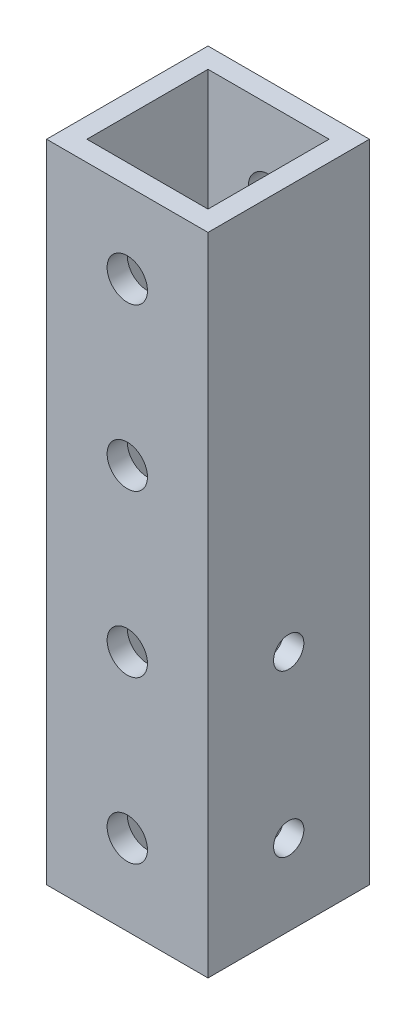
ISO-10303-21;
HEADER;
FILE_DESCRIPTION(('STEP AP214'),'2;1');
FILE_NAME('part.step','',(''),(''),'','','');
FILE_SCHEMA(('AUTOMOTIVE_DESIGN { 1 0 10303 214 1 1 1 1 }'));
ENDSEC;
DATA;
#1=APPLICATION_CONTEXT('core data for automotive mechanical design processes');
#2=APPLICATION_PROTOCOL_DEFINITION('international standard','automotive_design',2000,#1);
#3=PRODUCT_CONTEXT('',#1,'mechanical');
#4=PRODUCT('Part','Part','',(#3));
#5=PRODUCT_RELATED_PRODUCT_CATEGORY('part','',(#4));
#6=PRODUCT_DEFINITION_FORMATION('','',#4);
#7=PRODUCT_DEFINITION_CONTEXT('part definition',#1,'design');
#8=PRODUCT_DEFINITION('design','',#6,#7);
#9=PRODUCT_DEFINITION_SHAPE('','',#8);
#10=(LENGTH_UNIT() NAMED_UNIT(*) SI_UNIT(.MILLI.,.METRE.));
#11=(NAMED_UNIT(*) PLANE_ANGLE_UNIT() SI_UNIT($,.RADIAN.));
#12=(NAMED_UNIT(*) SI_UNIT($,.STERADIAN.) SOLID_ANGLE_UNIT());
#13=UNCERTAINTY_MEASURE_WITH_UNIT(LENGTH_MEASURE(1.E-05),#10,'distance_accuracy_value','');
#14=(GEOMETRIC_REPRESENTATION_CONTEXT(3) GLOBAL_UNCERTAINTY_ASSIGNED_CONTEXT((#13)) GLOBAL_UNIT_ASSIGNED_CONTEXT((#10,
#11,#12)) REPRESENTATION_CONTEXT('',''));
#15=CARTESIAN_POINT('',(0.,0.,0.));
#16=DIRECTION('',(0.,0.,1.));
#17=DIRECTION('',(1.,0.,0.));
#18=AXIS2_PLACEMENT_3D('',#15,#16,#17);
#19=CARTESIAN_POINT('',(0.,0.,25.4));
#20=DIRECTION('',(0.,1.,0.));
#21=DIRECTION('',(0.,0.,1.));
#22=AXIS2_PLACEMENT_3D('',#19,#20,#21);
#23=PLANE('',#22);
#24=DIRECTION('',(1.,0.,0.));
#25=VECTOR('',#24,1.);
#26=CARTESIAN_POINT('',(0.,0.,0.));
#27=LINE('',#26,#25);
#28=CARTESIAN_POINT('',(0.,0.,0.));
#29=VERTEX_POINT('',#28);
#30=CARTESIAN_POINT('',(25.4,0.,0.));
#31=VERTEX_POINT('',#30);
#32=EDGE_CURVE('E152',#29,#31,#27,.T.);
#33=ORIENTED_EDGE('',*,*,#32,.T.);
#34=DIRECTION('',(0.,0.,-1.));
#35=VECTOR('',#34,1.);
#36=CARTESIAN_POINT('',(25.4,0.,25.4));
#37=LINE('',#36,#35);
#38=CARTESIAN_POINT('',(25.4,0.,25.4));
#39=VERTEX_POINT('',#38);
#40=EDGE_CURVE('E46',#39,#31,#37,.T.);
#41=ORIENTED_EDGE('',*,*,#40,.F.);
#42=DIRECTION('',(1.,0.,0.));
#43=VECTOR('',#42,1.);
#44=CARTESIAN_POINT('',(0.,0.,25.4));
#45=LINE('',#44,#43);
#46=CARTESIAN_POINT('',(0.,0.,25.4));
#47=VERTEX_POINT('',#46);
#48=EDGE_CURVE('E142',#47,#39,#45,.T.);
#49=ORIENTED_EDGE('',*,*,#48,.F.);
#50=DIRECTION('',(0.,0.,-1.));
#51=VECTOR('',#50,1.);
#52=CARTESIAN_POINT('',(0.,0.,25.4));
#53=LINE('',#52,#51);
#54=EDGE_CURVE('E11',#47,#29,#53,.T.);
#55=ORIENTED_EDGE('',*,*,#54,.T.);
#56=EDGE_LOOP('',(#33,#41,#49,#55));
#57=FACE_BOUND('',#56,.T.);
#58=DIRECTION('',(1.,0.,0.));
#59=VECTOR('',#58,1.);
#60=CARTESIAN_POINT('',(0.,0.,3.175));
#61=LINE('',#60,#59);
#62=CARTESIAN_POINT('',(3.175,0.,3.175));
#63=VERTEX_POINT('',#62);
#64=CARTESIAN_POINT('',(22.225,0.,3.175));
#65=VERTEX_POINT('',#64);
#66=EDGE_CURVE('E117',#63,#65,#61,.T.);
#67=ORIENTED_EDGE('',*,*,#66,.F.);
#68=DIRECTION('',(0.,0.,-1.));
#69=VECTOR('',#68,1.);
#70=CARTESIAN_POINT('',(3.175,0.,25.4));
#71=LINE('',#70,#69);
#72=CARTESIAN_POINT('',(3.175,0.,22.225));
#73=VERTEX_POINT('',#72);
#74=EDGE_CURVE('E104',#73,#63,#71,.T.);
#75=ORIENTED_EDGE('',*,*,#74,.F.);
#76=DIRECTION('',(1.,0.,0.));
#77=VECTOR('',#76,1.);
#78=CARTESIAN_POINT('',(0.,0.,22.225));
#79=LINE('',#78,#77);
#80=CARTESIAN_POINT('',(22.225,0.,22.225));
#81=VERTEX_POINT('',#80);
#82=EDGE_CURVE('E130',#73,#81,#79,.T.);
#83=ORIENTED_EDGE('',*,*,#82,.T.);
#84=DIRECTION('',(0.,0.,-1.));
#85=VECTOR('',#84,1.);
#86=CARTESIAN_POINT('',(22.225,0.,25.4));
#87=LINE('',#86,#85);
#88=EDGE_CURVE('E113',#81,#65,#87,.T.);
#89=ORIENTED_EDGE('',*,*,#88,.T.);
#90=EDGE_LOOP('',(#67,#75,#83,#89));
#91=FACE_BOUND('',#90,.T.);
#92=ADVANCED_FACE('F37',(#57,#91),#23,.F.);
#93=CARTESIAN_POINT('',(0.,101.6,25.4));
#94=DIRECTION('',(0.,-1.,0.));
#95=DIRECTION('',(0.,0.,-1.));
#96=AXIS2_PLACEMENT_3D('',#93,#94,#95);
#97=PLANE('',#96);
#98=DIRECTION('',(-1.,0.,0.));
#99=VECTOR('',#98,1.);
#100=CARTESIAN_POINT('',(0.,101.6,0.));
#101=LINE('',#100,#99);
#102=CARTESIAN_POINT('',(25.4,101.6,0.));
#103=VERTEX_POINT('',#102);
#104=CARTESIAN_POINT('',(0.,101.6,0.));
#105=VERTEX_POINT('',#104);
#106=EDGE_CURVE('E143',#103,#105,#101,.T.);
#107=ORIENTED_EDGE('',*,*,#106,.T.);
#108=DIRECTION('',(0.,0.,-1.));
#109=VECTOR('',#108,1.);
#110=CARTESIAN_POINT('',(0.,101.6,25.4));
#111=LINE('',#110,#109);
#112=CARTESIAN_POINT('',(0.,101.6,25.4));
#113=VERTEX_POINT('',#112);
#114=EDGE_CURVE('E149',#113,#105,#111,.T.);
#115=ORIENTED_EDGE('',*,*,#114,.F.);
#116=DIRECTION('',(-1.,0.,0.));
#117=VECTOR('',#116,1.);
#118=CARTESIAN_POINT('',(0.,101.6,25.4));
#119=LINE('',#118,#117);
#120=CARTESIAN_POINT('',(25.4,101.6,25.4));
#121=VERTEX_POINT('',#120);
#122=EDGE_CURVE('E147',#121,#113,#119,.T.);
#123=ORIENTED_EDGE('',*,*,#122,.F.);
#124=DIRECTION('',(0.,0.,-1.));
#125=VECTOR('',#124,1.);
#126=CARTESIAN_POINT('',(25.4,101.6,25.4));
#127=LINE('',#126,#125);
#128=EDGE_CURVE('E159',#121,#103,#127,.T.);
#129=ORIENTED_EDGE('',*,*,#128,.T.);
#130=EDGE_LOOP('',(#107,#115,#123,#129));
#131=FACE_BOUND('',#130,.T.);
#132=DIRECTION('',(-1.,0.,0.));
#133=VECTOR('',#132,1.);
#134=CARTESIAN_POINT('',(0.,101.6,3.175));
#135=LINE('',#134,#133);
#136=CARTESIAN_POINT('',(22.225,101.6,3.175));
#137=VERTEX_POINT('',#136);
#138=CARTESIAN_POINT('',(3.175,101.6,3.175));
#139=VERTEX_POINT('',#138);
#140=EDGE_CURVE('E120',#137,#139,#135,.T.);
#141=ORIENTED_EDGE('',*,*,#140,.F.);
#142=DIRECTION('',(0.,0.,-1.));
#143=VECTOR('',#142,1.);
#144=CARTESIAN_POINT('',(22.225,101.6,25.4));
#145=LINE('',#144,#143);
#146=CARTESIAN_POINT('',(22.225,101.6,22.225));
#147=VERTEX_POINT('',#146);
#148=EDGE_CURVE('E129',#147,#137,#145,.T.);
#149=ORIENTED_EDGE('',*,*,#148,.F.);
#150=DIRECTION('',(-1.,0.,0.));
#151=VECTOR('',#150,1.);
#152=CARTESIAN_POINT('',(0.,101.6,22.225));
#153=LINE('',#152,#151);
#154=CARTESIAN_POINT('',(3.175,101.6,22.225));
#155=VERTEX_POINT('',#154);
#156=EDGE_CURVE('E61',#147,#155,#153,.T.);
#157=ORIENTED_EDGE('',*,*,#156,.T.);
#158=DIRECTION('',(0.,0.,-1.));
#159=VECTOR('',#158,1.);
#160=CARTESIAN_POINT('',(3.175,101.6,25.4));
#161=LINE('',#160,#159);
#162=EDGE_CURVE('E133',#155,#139,#161,.T.);
#163=ORIENTED_EDGE('',*,*,#162,.T.);
#164=EDGE_LOOP('',(#141,#149,#157,#163));
#165=FACE_BOUND('',#164,.T.);
#166=ADVANCED_FACE('F229',(#131,#165),#97,.F.);
#167=CARTESIAN_POINT('',(0.,0.,25.4));
#168=DIRECTION('',(1.,0.,0.));
#169=DIRECTION('',(0.,0.,-1.));
#170=AXIS2_PLACEMENT_3D('',#167,#168,#169);
#171=PLANE('',#170);
#172=DIRECTION('',(0.,-1.,0.));
#173=VECTOR('',#172,1.);
#174=CARTESIAN_POINT('',(0.,0.,0.));
#175=LINE('',#174,#173);
#176=EDGE_CURVE('E112',#105,#29,#175,.T.);
#177=ORIENTED_EDGE('',*,*,#176,.T.);
#178=ORIENTED_EDGE('',*,*,#54,.F.);
#179=DIRECTION('',(0.,-1.,0.));
#180=VECTOR('',#179,1.);
#181=CARTESIAN_POINT('',(0.,0.,25.4));
#182=LINE('',#181,#180);
#183=EDGE_CURVE('E139',#113,#47,#182,.T.);
#184=ORIENTED_EDGE('',*,*,#183,.F.);
#185=ORIENTED_EDGE('',*,*,#114,.T.);
#186=EDGE_LOOP('',(#177,#178,#184,#185));
#187=FACE_BOUND('',#186,.T.);
#188=ADVANCED_FACE('F39',(#187),#171,.F.);
#189=CARTESIAN_POINT('',(25.4,0.,25.4));
#190=DIRECTION('',(-1.,0.,0.));
#191=DIRECTION('',(0.,0.,1.));
#192=AXIS2_PLACEMENT_3D('',#189,#190,#191);
#193=PLANE('',#192);
#194=CARTESIAN_POINT('',(25.4,12.7,12.7));
#195=DIRECTION('',(1.,0.,0.));
#196=DIRECTION('',(0.,0.,-1.));
#197=AXIS2_PLACEMENT_3D('',#194,#195,#196);
#198=CIRCLE('',#197,2.38125);
#199=CARTESIAN_POINT('',(25.4,12.7,10.31875));
#200=VERTEX_POINT('',#199);
#201=EDGE_CURVE('E181',#200,#200,#198,.T.);
#202=ORIENTED_EDGE('',*,*,#201,.F.);
#203=EDGE_LOOP('',(#202));
#204=FACE_BOUND('',#203,.T.);
#205=CARTESIAN_POINT('',(25.4,38.1,12.7));
#206=DIRECTION('',(1.,0.,0.));
#207=DIRECTION('',(0.,0.,-1.));
#208=AXIS2_PLACEMENT_3D('',#205,#206,#207);
#209=CIRCLE('',#208,2.38125);
#210=CARTESIAN_POINT('',(25.4,38.1,10.31875));
#211=VERTEX_POINT('',#210);
#212=EDGE_CURVE('E187',#211,#211,#209,.T.);
#213=ORIENTED_EDGE('',*,*,#212,.F.);
#214=EDGE_LOOP('',(#213));
#215=FACE_BOUND('',#214,.T.);
#216=DIRECTION('',(0.,1.,0.));
#217=VECTOR('',#216,1.);
#218=CARTESIAN_POINT('',(25.4,0.,0.));
#219=LINE('',#218,#217);
#220=EDGE_CURVE('E154',#31,#103,#219,.T.);
#221=ORIENTED_EDGE('',*,*,#220,.T.);
#222=ORIENTED_EDGE('',*,*,#128,.F.);
#223=DIRECTION('',(0.,1.,0.));
#224=VECTOR('',#223,1.);
#225=CARTESIAN_POINT('',(25.4,0.,25.4));
#226=LINE('',#225,#224);
#227=EDGE_CURVE('E145',#39,#121,#226,.T.);
#228=ORIENTED_EDGE('',*,*,#227,.F.);
#229=ORIENTED_EDGE('',*,*,#40,.T.);
#230=EDGE_LOOP('',(#221,#222,#228,#229));
#231=FACE_BOUND('',#230,.T.);
#232=ADVANCED_FACE('F253',(#204,#215,#231),#193,.F.);
#233=CARTESIAN_POINT('',(0.,0.,25.4));
#234=DIRECTION('',(0.,0.,-1.));
#235=DIRECTION('',(-1.,0.,0.));
#236=AXIS2_PLACEMENT_3D('',#233,#234,#235);
#237=PLANE('',#236);
#238=CARTESIAN_POINT('',(12.7,12.7,25.4));
#239=DIRECTION('',(0.,0.,1.));
#240=DIRECTION('',(1.,0.,0.));
#241=AXIS2_PLACEMENT_3D('',#238,#239,#240);
#242=CIRCLE('',#241,3.175);
#243=CARTESIAN_POINT('',(15.875,12.7,25.4));
#244=VERTEX_POINT('',#243);
#245=EDGE_CURVE('E196',#244,#244,#242,.T.);
#246=ORIENTED_EDGE('',*,*,#245,.F.);
#247=EDGE_LOOP('',(#246));
#248=FACE_BOUND('',#247,.T.);
#249=CARTESIAN_POINT('',(12.7,63.5,25.4));
#250=DIRECTION('',(0.,0.,1.));
#251=DIRECTION('',(1.,0.,0.));
#252=AXIS2_PLACEMENT_3D('',#249,#250,#251);
#253=CIRCLE('',#252,3.175);
#254=CARTESIAN_POINT('',(15.875,63.5,25.4));
#255=VERTEX_POINT('',#254);
#256=EDGE_CURVE('E200',#255,#255,#253,.T.);
#257=ORIENTED_EDGE('',*,*,#256,.F.);
#258=EDGE_LOOP('',(#257));
#259=FACE_BOUND('',#258,.T.);
#260=CARTESIAN_POINT('',(12.7,88.9,25.4));
#261=DIRECTION('',(0.,0.,1.));
#262=DIRECTION('',(1.,0.,0.));
#263=AXIS2_PLACEMENT_3D('',#260,#261,#262);
#264=CIRCLE('',#263,3.175);
#265=CARTESIAN_POINT('',(15.875,88.9,25.4));
#266=VERTEX_POINT('',#265);
#267=EDGE_CURVE('E211',#266,#266,#264,.T.);
#268=ORIENTED_EDGE('',*,*,#267,.F.);
#269=EDGE_LOOP('',(#268));
#270=FACE_BOUND('',#269,.T.);
#271=CARTESIAN_POINT('',(12.7,38.1,25.4));
#272=DIRECTION('',(0.,0.,1.));
#273=DIRECTION('',(1.,0.,0.));
#274=AXIS2_PLACEMENT_3D('',#271,#272,#273);
#275=CIRCLE('',#274,3.175);
#276=CARTESIAN_POINT('',(15.875,38.1,25.4));
#277=VERTEX_POINT('',#276);
#278=EDGE_CURVE('E199',#277,#277,#275,.T.);
#279=ORIENTED_EDGE('',*,*,#278,.F.);
#280=EDGE_LOOP('',(#279));
#281=FACE_BOUND('',#280,.T.);
#282=ORIENTED_EDGE('',*,*,#183,.T.);
#283=ORIENTED_EDGE('',*,*,#48,.T.);
#284=ORIENTED_EDGE('',*,*,#227,.T.);
#285=ORIENTED_EDGE('',*,*,#122,.T.);
#286=EDGE_LOOP('',(#282,#283,#284,#285));
#287=FACE_BOUND('',#286,.T.);
#288=ADVANCED_FACE('F255',(#248,#259,#270,#281,#287),#237,.F.);
#289=CARTESIAN_POINT('',(0.,0.,0.));
#290=DIRECTION('',(0.,0.,-1.));
#291=DIRECTION('',(-1.,0.,0.));
#292=AXIS2_PLACEMENT_3D('',#289,#290,#291);
#293=PLANE('',#292);
#294=CARTESIAN_POINT('',(12.7,12.7,0.));
#295=DIRECTION('',(0.,0.,1.));
#296=DIRECTION('',(1.,0.,0.));
#297=AXIS2_PLACEMENT_3D('',#294,#295,#296);
#298=CIRCLE('',#297,3.175);
#299=CARTESIAN_POINT('',(15.875,12.7,0.));
#300=VERTEX_POINT('',#299);
#301=EDGE_CURVE('E168',#300,#300,#298,.T.);
#302=ORIENTED_EDGE('',*,*,#301,.T.);
#303=EDGE_LOOP('',(#302));
#304=FACE_BOUND('',#303,.T.);
#305=CARTESIAN_POINT('',(12.7,63.5,0.));
#306=DIRECTION('',(0.,0.,1.));
#307=DIRECTION('',(1.,0.,0.));
#308=AXIS2_PLACEMENT_3D('',#305,#306,#307);
#309=CIRCLE('',#308,3.175);
#310=CARTESIAN_POINT('',(15.875,63.5,0.));
#311=VERTEX_POINT('',#310);
#312=EDGE_CURVE('E185',#311,#311,#309,.T.);
#313=ORIENTED_EDGE('',*,*,#312,.T.);
#314=EDGE_LOOP('',(#313));
#315=FACE_BOUND('',#314,.T.);
#316=CARTESIAN_POINT('',(12.7,88.9,0.));
#317=DIRECTION('',(0.,0.,1.));
#318=DIRECTION('',(1.,0.,0.));
#319=AXIS2_PLACEMENT_3D('',#316,#317,#318);
#320=CIRCLE('',#319,3.175);
#321=CARTESIAN_POINT('',(15.875,88.9,0.));
#322=VERTEX_POINT('',#321);
#323=EDGE_CURVE('E203',#322,#322,#320,.T.);
#324=ORIENTED_EDGE('',*,*,#323,.T.);
#325=EDGE_LOOP('',(#324));
#326=FACE_BOUND('',#325,.T.);
#327=CARTESIAN_POINT('',(12.7,38.1,0.));
#328=DIRECTION('',(0.,0.,1.));
#329=DIRECTION('',(1.,0.,0.));
#330=AXIS2_PLACEMENT_3D('',#327,#328,#329);
#331=CIRCLE('',#330,3.175);
#332=CARTESIAN_POINT('',(15.875,38.1,0.));
#333=VERTEX_POINT('',#332);
#334=EDGE_CURVE('E208',#333,#333,#331,.T.);
#335=ORIENTED_EDGE('',*,*,#334,.T.);
#336=EDGE_LOOP('',(#335));
#337=FACE_BOUND('',#336,.T.);
#338=ORIENTED_EDGE('',*,*,#176,.F.);
#339=ORIENTED_EDGE('',*,*,#106,.F.);
#340=ORIENTED_EDGE('',*,*,#220,.F.);
#341=ORIENTED_EDGE('',*,*,#32,.F.);
#342=EDGE_LOOP('',(#338,#339,#340,#341));
#343=FACE_BOUND('',#342,.T.);
#344=ADVANCED_FACE('F258',(#304,#315,#326,#337,#343),#293,.T.);
#345=CARTESIAN_POINT('',(3.175,0.,25.4));
#346=DIRECTION('',(1.,0.,0.));
#347=DIRECTION('',(0.,0.,-1.));
#348=AXIS2_PLACEMENT_3D('',#345,#346,#347);
#349=PLANE('',#348);
#350=DIRECTION('',(0.,-1.,0.));
#351=VECTOR('',#350,1.);
#352=CARTESIAN_POINT('',(3.175,0.,3.175));
#353=LINE('',#352,#351);
#354=EDGE_CURVE('E107',#139,#63,#353,.T.);
#355=ORIENTED_EDGE('',*,*,#354,.F.);
#356=ORIENTED_EDGE('',*,*,#162,.F.);
#357=DIRECTION('',(0.,-1.,0.));
#358=VECTOR('',#357,1.);
#359=CARTESIAN_POINT('',(3.175,0.,22.225));
#360=LINE('',#359,#358);
#361=EDGE_CURVE('E54',#155,#73,#360,.T.);
#362=ORIENTED_EDGE('',*,*,#361,.T.);
#363=ORIENTED_EDGE('',*,*,#74,.T.);
#364=EDGE_LOOP('',(#355,#356,#362,#363));
#365=FACE_BOUND('',#364,.T.);
#366=ADVANCED_FACE('F106',(#365),#349,.T.);
#367=CARTESIAN_POINT('',(22.225,0.,25.4));
#368=DIRECTION('',(-1.,0.,0.));
#369=DIRECTION('',(0.,0.,1.));
#370=AXIS2_PLACEMENT_3D('',#367,#368,#369);
#371=PLANE('',#370);
#372=CARTESIAN_POINT('',(22.225,12.7,12.7));
#373=DIRECTION('',(-1.,0.,0.));
#374=DIRECTION('',(0.,0.,1.));
#375=AXIS2_PLACEMENT_3D('',#372,#373,#374);
#376=CIRCLE('',#375,2.38125);
#377=CARTESIAN_POINT('',(22.225,12.7,15.08125));
#378=VERTEX_POINT('',#377);
#379=EDGE_CURVE('E41',#378,#378,#376,.T.);
#380=ORIENTED_EDGE('',*,*,#379,.F.);
#381=EDGE_LOOP('',(#380));
#382=FACE_BOUND('',#381,.T.);
#383=CARTESIAN_POINT('',(22.225,38.1,12.7));
#384=DIRECTION('',(-1.,0.,0.));
#385=DIRECTION('',(0.,0.,1.));
#386=AXIS2_PLACEMENT_3D('',#383,#384,#385);
#387=CIRCLE('',#386,2.38125);
#388=CARTESIAN_POINT('',(22.225,38.1,15.08125));
#389=VERTEX_POINT('',#388);
#390=EDGE_CURVE('E179',#389,#389,#387,.T.);
#391=ORIENTED_EDGE('',*,*,#390,.F.);
#392=EDGE_LOOP('',(#391));
#393=FACE_BOUND('',#392,.T.);
#394=DIRECTION('',(0.,1.,0.));
#395=VECTOR('',#394,1.);
#396=CARTESIAN_POINT('',(22.225,0.,3.175));
#397=LINE('',#396,#395);
#398=EDGE_CURVE('E124',#65,#137,#397,.T.);
#399=ORIENTED_EDGE('',*,*,#398,.F.);
#400=ORIENTED_EDGE('',*,*,#88,.F.);
#401=DIRECTION('',(0.,1.,0.));
#402=VECTOR('',#401,1.);
#403=CARTESIAN_POINT('',(22.225,0.,22.225));
#404=LINE('',#403,#402);
#405=EDGE_CURVE('E132',#81,#147,#404,.T.);
#406=ORIENTED_EDGE('',*,*,#405,.T.);
#407=ORIENTED_EDGE('',*,*,#148,.T.);
#408=EDGE_LOOP('',(#399,#400,#406,#407));
#409=FACE_BOUND('',#408,.T.);
#410=ADVANCED_FACE('F227',(#382,#393,#409),#371,.T.);
#411=CARTESIAN_POINT('',(0.,0.,22.225));
#412=DIRECTION('',(0.,0.,-1.));
#413=DIRECTION('',(-1.,0.,0.));
#414=AXIS2_PLACEMENT_3D('',#411,#412,#413);
#415=PLANE('',#414);
#416=CARTESIAN_POINT('',(12.7,12.7,22.225));
#417=DIRECTION('',(0.,0.,-1.));
#418=DIRECTION('',(-1.,0.,0.));
#419=AXIS2_PLACEMENT_3D('',#416,#417,#418);
#420=CIRCLE('',#419,3.175);
#421=CARTESIAN_POINT('',(9.525,12.7,22.225));
#422=VERTEX_POINT('',#421);
#423=EDGE_CURVE('E121',#422,#422,#420,.T.);
#424=ORIENTED_EDGE('',*,*,#423,.F.);
#425=EDGE_LOOP('',(#424));
#426=FACE_BOUND('',#425,.T.);
#427=CARTESIAN_POINT('',(12.7,63.5,22.225));
#428=DIRECTION('',(0.,0.,-1.));
#429=DIRECTION('',(-1.,0.,0.));
#430=AXIS2_PLACEMENT_3D('',#427,#428,#429);
#431=CIRCLE('',#430,3.175);
#432=CARTESIAN_POINT('',(9.525,63.5,22.225));
#433=VERTEX_POINT('',#432);
#434=EDGE_CURVE('E176',#433,#433,#431,.T.);
#435=ORIENTED_EDGE('',*,*,#434,.F.);
#436=EDGE_LOOP('',(#435));
#437=FACE_BOUND('',#436,.T.);
#438=CARTESIAN_POINT('',(12.7,88.9,22.225));
#439=DIRECTION('',(0.,0.,-1.));
#440=DIRECTION('',(-1.,0.,0.));
#441=AXIS2_PLACEMENT_3D('',#438,#439,#440);
#442=CIRCLE('',#441,3.175);
#443=CARTESIAN_POINT('',(9.525,88.9,22.225));
#444=VERTEX_POINT('',#443);
#445=EDGE_CURVE('E172',#444,#444,#442,.T.);
#446=ORIENTED_EDGE('',*,*,#445,.F.);
#447=EDGE_LOOP('',(#446));
#448=FACE_BOUND('',#447,.T.);
#449=CARTESIAN_POINT('',(12.7,38.1,22.225));
#450=DIRECTION('',(0.,0.,-1.));
#451=DIRECTION('',(-1.,0.,0.));
#452=AXIS2_PLACEMENT_3D('',#449,#450,#451);
#453=CIRCLE('',#452,3.175);
#454=CARTESIAN_POINT('',(9.525,38.1,22.225));
#455=VERTEX_POINT('',#454);
#456=EDGE_CURVE('E167',#455,#455,#453,.T.);
#457=ORIENTED_EDGE('',*,*,#456,.F.);
#458=EDGE_LOOP('',(#457));
#459=FACE_BOUND('',#458,.T.);
#460=ORIENTED_EDGE('',*,*,#361,.F.);
#461=ORIENTED_EDGE('',*,*,#156,.F.);
#462=ORIENTED_EDGE('',*,*,#405,.F.);
#463=ORIENTED_EDGE('',*,*,#82,.F.);
#464=EDGE_LOOP('',(#460,#461,#462,#463));
#465=FACE_BOUND('',#464,.T.);
#466=ADVANCED_FACE('F230',(#426,#437,#448,#459,#465),#415,.T.);
#467=CARTESIAN_POINT('',(0.,0.,3.175));
#468=DIRECTION('',(0.,0.,-1.));
#469=DIRECTION('',(-1.,0.,0.));
#470=AXIS2_PLACEMENT_3D('',#467,#468,#469);
#471=PLANE('',#470);
#472=CARTESIAN_POINT('',(12.7,12.7,3.175));
#473=DIRECTION('',(0.,0.,-1.));
#474=DIRECTION('',(-1.,0.,0.));
#475=AXIS2_PLACEMENT_3D('',#472,#473,#474);
#476=CIRCLE('',#475,3.175);
#477=CARTESIAN_POINT('',(9.525,12.7,3.175));
#478=VERTEX_POINT('',#477);
#479=EDGE_CURVE('E177',#478,#478,#476,.T.);
#480=ORIENTED_EDGE('',*,*,#479,.T.);
#481=EDGE_LOOP('',(#480));
#482=FACE_BOUND('',#481,.T.);
#483=CARTESIAN_POINT('',(12.7,63.5,3.175));
#484=DIRECTION('',(0.,0.,-1.));
#485=DIRECTION('',(-1.,0.,0.));
#486=AXIS2_PLACEMENT_3D('',#483,#484,#485);
#487=CIRCLE('',#486,3.175);
#488=CARTESIAN_POINT('',(9.525,63.5,3.175));
#489=VERTEX_POINT('',#488);
#490=EDGE_CURVE('E173',#489,#489,#487,.T.);
#491=ORIENTED_EDGE('',*,*,#490,.T.);
#492=EDGE_LOOP('',(#491));
#493=FACE_BOUND('',#492,.T.);
#494=CARTESIAN_POINT('',(12.7,88.9,3.175));
#495=DIRECTION('',(0.,0.,-1.));
#496=DIRECTION('',(-1.,0.,0.));
#497=AXIS2_PLACEMENT_3D('',#494,#495,#496);
#498=CIRCLE('',#497,3.175);
#499=CARTESIAN_POINT('',(9.525,88.9,3.175));
#500=VERTEX_POINT('',#499);
#501=EDGE_CURVE('E169',#500,#500,#498,.T.);
#502=ORIENTED_EDGE('',*,*,#501,.T.);
#503=EDGE_LOOP('',(#502));
#504=FACE_BOUND('',#503,.T.);
#505=CARTESIAN_POINT('',(12.7,38.1,3.175));
#506=DIRECTION('',(0.,0.,-1.));
#507=DIRECTION('',(-1.,0.,0.));
#508=AXIS2_PLACEMENT_3D('',#505,#506,#507);
#509=CIRCLE('',#508,3.175);
#510=CARTESIAN_POINT('',(9.525,38.1,3.175));
#511=VERTEX_POINT('',#510);
#512=EDGE_CURVE('E164',#511,#511,#509,.T.);
#513=ORIENTED_EDGE('',*,*,#512,.T.);
#514=EDGE_LOOP('',(#513));
#515=FACE_BOUND('',#514,.T.);
#516=ORIENTED_EDGE('',*,*,#354,.T.);
#517=ORIENTED_EDGE('',*,*,#66,.T.);
#518=ORIENTED_EDGE('',*,*,#398,.T.);
#519=ORIENTED_EDGE('',*,*,#140,.T.);
#520=EDGE_LOOP('',(#516,#517,#518,#519));
#521=FACE_BOUND('',#520,.T.);
#522=ADVANCED_FACE('F116',(#482,#493,#504,#515,#521),#471,.F.);
#523=CARTESIAN_POINT('',(12.7,38.1,0.));
#524=DIRECTION('',(0.,0.,1.));
#525=DIRECTION('',(1.,0.,0.));
#526=AXIS2_PLACEMENT_3D('',#523,#524,#525);
#527=CYLINDRICAL_SURFACE('',#526,3.175);
#528=ORIENTED_EDGE('',*,*,#334,.F.);
#529=EDGE_LOOP('',(#528));
#530=FACE_BOUND('',#529,.T.);
#531=ORIENTED_EDGE('',*,*,#512,.F.);
#532=EDGE_LOOP('',(#531));
#533=FACE_BOUND('',#532,.T.);
#534=ADVANCED_FACE('F238',(#530,#533),#527,.F.);
#535=CARTESIAN_POINT('',(12.7,88.9,0.));
#536=DIRECTION('',(0.,0.,1.));
#537=DIRECTION('',(1.,0.,0.));
#538=AXIS2_PLACEMENT_3D('',#535,#536,#537);
#539=CYLINDRICAL_SURFACE('',#538,3.175);
#540=ORIENTED_EDGE('',*,*,#323,.F.);
#541=EDGE_LOOP('',(#540));
#542=FACE_BOUND('',#541,.T.);
#543=ORIENTED_EDGE('',*,*,#501,.F.);
#544=EDGE_LOOP('',(#543));
#545=FACE_BOUND('',#544,.T.);
#546=ADVANCED_FACE('F367',(#542,#545),#539,.F.);
#547=CARTESIAN_POINT('',(12.7,63.5,0.));
#548=DIRECTION('',(0.,0.,1.));
#549=DIRECTION('',(1.,0.,0.));
#550=AXIS2_PLACEMENT_3D('',#547,#548,#549);
#551=CYLINDRICAL_SURFACE('',#550,3.175);
#552=ORIENTED_EDGE('',*,*,#312,.F.);
#553=EDGE_LOOP('',(#552));
#554=FACE_BOUND('',#553,.T.);
#555=ORIENTED_EDGE('',*,*,#490,.F.);
#556=EDGE_LOOP('',(#555));
#557=FACE_BOUND('',#556,.T.);
#558=ADVANCED_FACE('F357',(#554,#557),#551,.F.);
#559=CARTESIAN_POINT('',(12.7,12.7,0.));
#560=DIRECTION('',(0.,0.,1.));
#561=DIRECTION('',(1.,0.,0.));
#562=AXIS2_PLACEMENT_3D('',#559,#560,#561);
#563=CYLINDRICAL_SURFACE('',#562,3.175);
#564=ORIENTED_EDGE('',*,*,#301,.F.);
#565=EDGE_LOOP('',(#564));
#566=FACE_BOUND('',#565,.T.);
#567=ORIENTED_EDGE('',*,*,#479,.F.);
#568=EDGE_LOOP('',(#567));
#569=FACE_BOUND('',#568,.T.);
#570=ADVANCED_FACE('F347',(#566,#569),#563,.F.);
#571=ORIENTED_EDGE('',*,*,#456,.T.);
#572=EDGE_LOOP('',(#571));
#573=FACE_BOUND('',#572,.T.);
#574=ORIENTED_EDGE('',*,*,#278,.T.);
#575=EDGE_LOOP('',(#574));
#576=FACE_BOUND('',#575,.T.);
#577=ADVANCED_FACE('F364',(#573,#576),#527,.F.);
#578=ORIENTED_EDGE('',*,*,#445,.T.);
#579=EDGE_LOOP('',(#578));
#580=FACE_BOUND('',#579,.T.);
#581=ORIENTED_EDGE('',*,*,#267,.T.);
#582=EDGE_LOOP('',(#581));
#583=FACE_BOUND('',#582,.T.);
#584=ADVANCED_FACE('F354',(#580,#583),#539,.F.);
#585=ORIENTED_EDGE('',*,*,#434,.T.);
#586=EDGE_LOOP('',(#585));
#587=FACE_BOUND('',#586,.T.);
#588=ORIENTED_EDGE('',*,*,#256,.T.);
#589=EDGE_LOOP('',(#588));
#590=FACE_BOUND('',#589,.T.);
#591=ADVANCED_FACE('F344',(#587,#590),#551,.F.);
#592=ORIENTED_EDGE('',*,*,#423,.T.);
#593=EDGE_LOOP('',(#592));
#594=FACE_BOUND('',#593,.T.);
#595=ORIENTED_EDGE('',*,*,#245,.T.);
#596=EDGE_LOOP('',(#595));
#597=FACE_BOUND('',#596,.T.);
#598=ADVANCED_FACE('F304',(#594,#597),#563,.F.);
#599=CARTESIAN_POINT('',(17.78,38.1,12.7));
#600=DIRECTION('',(1.,0.,0.));
#601=DIRECTION('',(0.,0.,-1.));
#602=AXIS2_PLACEMENT_3D('',#599,#600,#601);
#603=CYLINDRICAL_SURFACE('',#602,2.38125);
#604=ORIENTED_EDGE('',*,*,#390,.T.);
#605=EDGE_LOOP('',(#604));
#606=FACE_BOUND('',#605,.T.);
#607=ORIENTED_EDGE('',*,*,#212,.T.);
#608=EDGE_LOOP('',(#607));
#609=FACE_BOUND('',#608,.T.);
#610=ADVANCED_FACE('F319',(#606,#609),#603,.F.);
#611=CARTESIAN_POINT('',(17.78,12.7,12.7));
#612=DIRECTION('',(1.,0.,0.));
#613=DIRECTION('',(0.,0.,-1.));
#614=AXIS2_PLACEMENT_3D('',#611,#612,#613);
#615=CYLINDRICAL_SURFACE('',#614,2.38125);
#616=ORIENTED_EDGE('',*,*,#379,.T.);
#617=EDGE_LOOP('',(#616));
#618=FACE_BOUND('',#617,.T.);
#619=ORIENTED_EDGE('',*,*,#201,.T.);
#620=EDGE_LOOP('',(#619));
#621=FACE_BOUND('',#620,.T.);
#622=ADVANCED_FACE('F324',(#618,#621),#615,.F.);
#623=CLOSED_SHELL('',(#92,#166,#188,#232,#288,#344,#366,#410,#466,#522,#534,#546,#558,#570,#577,
#584,#591,#598,#610,#622));
#624=MANIFOLD_SOLID_BREP('B2',#623);
#625=ADVANCED_BREP_SHAPE_REPRESENTATION('',(#18,#624),#14);
#626=SHAPE_DEFINITION_REPRESENTATION(#9,#625);
ENDSEC;
END-ISO-10303-21;
